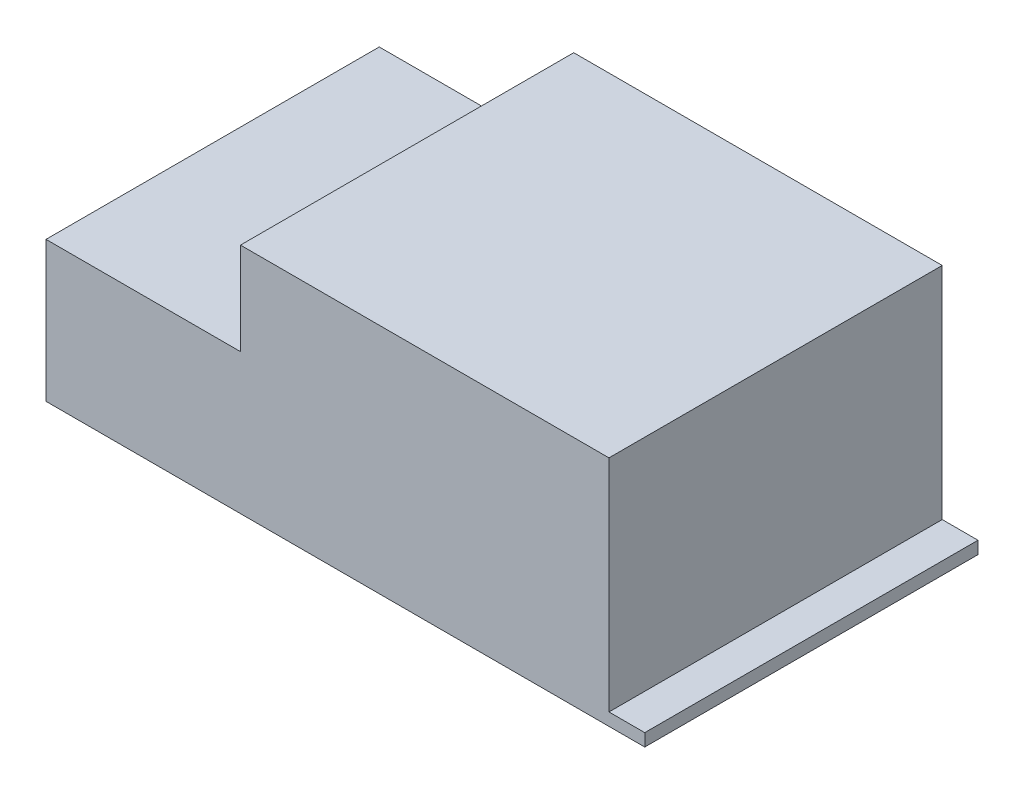
ISO-10303-21;
HEADER;
FILE_DESCRIPTION(('STEP AP214'),'2;1');
FILE_NAME('part.step','',(''),(''),'','','');
FILE_SCHEMA(('AUTOMOTIVE_DESIGN { 1 0 10303 214 1 1 1 1 }'));
ENDSEC;
DATA;
#1=APPLICATION_CONTEXT('core data for automotive mechanical design processes');
#2=APPLICATION_PROTOCOL_DEFINITION('international standard','automotive_design',2000,#1);
#3=PRODUCT_CONTEXT('',#1,'mechanical');
#4=PRODUCT('Part','Part','',(#3));
#5=PRODUCT_RELATED_PRODUCT_CATEGORY('part','',(#4));
#6=PRODUCT_DEFINITION_FORMATION('','',#4);
#7=PRODUCT_DEFINITION_CONTEXT('part definition',#1,'design');
#8=PRODUCT_DEFINITION('design','',#6,#7);
#9=PRODUCT_DEFINITION_SHAPE('','',#8);
#10=(LENGTH_UNIT() NAMED_UNIT(*) SI_UNIT(.MILLI.,.METRE.));
#11=(NAMED_UNIT(*) PLANE_ANGLE_UNIT() SI_UNIT($,.RADIAN.));
#12=(NAMED_UNIT(*) SI_UNIT($,.STERADIAN.) SOLID_ANGLE_UNIT());
#13=UNCERTAINTY_MEASURE_WITH_UNIT(LENGTH_MEASURE(1.E-05),#10,'distance_accuracy_value','');
#14=(GEOMETRIC_REPRESENTATION_CONTEXT(3) GLOBAL_UNCERTAINTY_ASSIGNED_CONTEXT((#13)) GLOBAL_UNIT_ASSIGNED_CONTEXT((#10,
#11,#12)) REPRESENTATION_CONTEXT('',''));
#15=CARTESIAN_POINT('',(0.,0.,0.));
#16=DIRECTION('',(0.,0.,1.));
#17=DIRECTION('',(1.,0.,0.));
#18=AXIS2_PLACEMENT_3D('',#15,#16,#17);
#19=CARTESIAN_POINT('',(-46.6871505090109,78.6556911879619,225.157566589967));
#20=DIRECTION('',(1.,0.,0.));
#21=DIRECTION('',(0.,1.,0.));
#22=AXIS2_PLACEMENT_3D('',#19,#20,#21);
#23=PLANE('',#22);
#24=CARTESIAN_POINT('',(-46.6871505090109,59.3229468039642,32.421386426818));
#25=DIRECTION('',(-1.,0.,0.));
#26=DIRECTION('',(0.,-1.,0.));
#27=AXIS2_PLACEMENT_3D('',#24,#25,#26);
#28=CIRCLE('',#27,5.51543289325506);
#29=CARTESIAN_POINT('',(-46.6871505090109,53.8075139107091,32.421386426818));
#30=VERTEX_POINT('',#29);
#31=EDGE_CURVE('E199',#30,#30,#28,.T.);
#32=ORIENTED_EDGE('',*,*,#31,.F.);
#33=EDGE_LOOP('',(#32));
#34=FACE_BOUND('',#33,.T.);
#35=DIRECTION('',(0.,0.,-1.));
#36=VECTOR('',#35,1.);
#37=CARTESIAN_POINT('',(-46.6871505090109,44.9711946730302,225.157566589967));
#38=LINE('',#37,#36);
#39=CARTESIAN_POINT('',(-46.6871505090109,44.9711946730302,70.958248184639));
#40=VERTEX_POINT('',#39);
#41=CARTESIAN_POINT('',(-46.6871505090109,44.9711946730302,-9.04175181536104));
#42=VERTEX_POINT('',#41);
#43=EDGE_CURVE('E226',#40,#42,#38,.T.);
#44=ORIENTED_EDGE('',*,*,#43,.F.);
#45=DIRECTION('',(0.,1.,0.));
#46=VECTOR('',#45,1.);
#47=CARTESIAN_POINT('',(-46.6871505090109,78.6556911879619,70.958248184639));
#48=LINE('',#47,#46);
#49=CARTESIAN_POINT('',(-46.6871505090109,78.6556911879619,70.9582481846391));
#50=VERTEX_POINT('',#49);
#51=EDGE_CURVE('E231',#40,#50,#48,.T.);
#52=ORIENTED_EDGE('',*,*,#51,.T.);
#53=DIRECTION('',(0.,0.,-1.));
#54=VECTOR('',#53,1.);
#55=CARTESIAN_POINT('',(-46.6871505090109,78.6556911879619,225.157566589967));
#56=LINE('',#55,#54);
#57=CARTESIAN_POINT('',(-46.6871505090109,78.6556911879619,-9.04175181536104));
#58=VERTEX_POINT('',#57);
#59=EDGE_CURVE('E243',#50,#58,#56,.T.);
#60=ORIENTED_EDGE('',*,*,#59,.T.);
#61=DIRECTION('',(0.,1.,0.));
#62=VECTOR('',#61,1.);
#63=CARTESIAN_POINT('',(-46.6871505090109,78.6556911879619,-9.04175181536104));
#64=LINE('',#63,#62);
#65=EDGE_CURVE('E217',#42,#58,#64,.T.);
#66=ORIENTED_EDGE('',*,*,#65,.F.);
#67=EDGE_LOOP('',(#44,#52,#60,#66));
#68=FACE_BOUND('',#67,.T.);
#69=ADVANCED_FACE('F39',(#34,#68),#23,.F.);
#70=CARTESIAN_POINT('',(0.,78.6556911879619,225.157566589967));
#71=DIRECTION('',(0.,-1.,0.));
#72=DIRECTION('',(0.,0.,-1.));
#73=AXIS2_PLACEMENT_3D('',#70,#71,#72);
#74=PLANE('',#73);
#75=ORIENTED_EDGE('',*,*,#59,.F.);
#76=DIRECTION('',(1.,0.,0.));
#77=VECTOR('',#76,1.);
#78=CARTESIAN_POINT('',(0.,78.6556911879619,70.958248184639));
#79=LINE('',#78,#77);
#80=CARTESIAN_POINT('',(0.,78.6556911879619,70.958248184639));
#81=VERTEX_POINT('',#80);
#82=EDGE_CURVE('E227',#50,#81,#79,.T.);
#83=ORIENTED_EDGE('',*,*,#82,.T.);
#84=DIRECTION('',(0.,0.,-1.));
#85=VECTOR('',#84,1.);
#86=CARTESIAN_POINT('',(0.,78.6556911879619,225.157566589967));
#87=LINE('',#86,#85);
#88=CARTESIAN_POINT('',(0.,78.6556911879619,-9.04175181536104));
#89=VERTEX_POINT('',#88);
#90=EDGE_CURVE('E245',#81,#89,#87,.T.);
#91=ORIENTED_EDGE('',*,*,#90,.T.);
#92=DIRECTION('',(1.,0.,0.));
#93=VECTOR('',#92,1.);
#94=CARTESIAN_POINT('',(0.,78.6556911879619,-9.04175181536104));
#95=LINE('',#94,#93);
#96=EDGE_CURVE('E214',#58,#89,#95,.T.);
#97=ORIENTED_EDGE('',*,*,#96,.F.);
#98=EDGE_LOOP('',(#75,#83,#91,#97));
#99=FACE_BOUND('',#98,.T.);
#100=ADVANCED_FACE('F285',(#99),#74,.F.);
#101=CARTESIAN_POINT('',(0.,100.803034254401,225.157566589967));
#102=DIRECTION('',(1.,0.,0.));
#103=DIRECTION('',(0.,0.,-1.));
#104=AXIS2_PLACEMENT_3D('',#101,#102,#103);
#105=PLANE('',#104);
#106=ORIENTED_EDGE('',*,*,#90,.F.);
#107=DIRECTION('',(0.,1.,0.));
#108=VECTOR('',#107,1.);
#109=CARTESIAN_POINT('',(0.,100.803034254401,70.958248184639));
#110=LINE('',#109,#108);
#111=CARTESIAN_POINT('',(0.,100.803034254401,70.958248184639));
#112=VERTEX_POINT('',#111);
#113=EDGE_CURVE('E230',#81,#112,#110,.T.);
#114=ORIENTED_EDGE('',*,*,#113,.T.);
#115=DIRECTION('',(0.,0.,-1.));
#116=VECTOR('',#115,1.);
#117=CARTESIAN_POINT('',(0.,100.803034254401,225.157566589967));
#118=LINE('',#117,#116);
#119=CARTESIAN_POINT('',(0.,100.803034254401,-9.04175181536104));
#120=VERTEX_POINT('',#119);
#121=EDGE_CURVE('E247',#112,#120,#118,.T.);
#122=ORIENTED_EDGE('',*,*,#121,.T.);
#123=DIRECTION('',(0.,1.,0.));
#124=VECTOR('',#123,1.);
#125=CARTESIAN_POINT('',(0.,100.803034254401,-9.04175181536104));
#126=LINE('',#125,#124);
#127=EDGE_CURVE('E211',#89,#120,#126,.T.);
#128=ORIENTED_EDGE('',*,*,#127,.F.);
#129=EDGE_LOOP('',(#106,#114,#122,#128));
#130=FACE_BOUND('',#129,.T.);
#131=ADVANCED_FACE('F282',(#130),#105,.F.);
#132=CARTESIAN_POINT('',(88.4595728208851,100.803034254401,225.157566589967));
#133=DIRECTION('',(0.,-1.,0.));
#134=DIRECTION('',(0.,0.,-1.));
#135=AXIS2_PLACEMENT_3D('',#132,#133,#134);
#136=PLANE('',#135);
#137=ORIENTED_EDGE('',*,*,#121,.F.);
#138=DIRECTION('',(1.,0.,0.));
#139=VECTOR('',#138,1.);
#140=CARTESIAN_POINT('',(88.4595728208851,100.803034254401,70.958248184639));
#141=LINE('',#140,#139);
#142=CARTESIAN_POINT('',(88.4595728208851,100.803034254401,70.958248184639));
#143=VERTEX_POINT('',#142);
#144=EDGE_CURVE('E234',#112,#143,#141,.T.);
#145=ORIENTED_EDGE('',*,*,#144,.T.);
#146=DIRECTION('',(0.,0.,-1.));
#147=VECTOR('',#146,1.);
#148=CARTESIAN_POINT('',(88.4595728208851,100.803034254401,225.157566589967));
#149=LINE('',#148,#147);
#150=CARTESIAN_POINT('',(88.4595728208851,100.803034254401,-9.04175181536104));
#151=VERTEX_POINT('',#150);
#152=EDGE_CURVE('E249',#143,#151,#149,.T.);
#153=ORIENTED_EDGE('',*,*,#152,.T.);
#154=DIRECTION('',(1.,0.,0.));
#155=VECTOR('',#154,1.);
#156=CARTESIAN_POINT('',(88.4595728208851,100.803034254401,-9.04175181536104));
#157=LINE('',#156,#155);
#158=EDGE_CURVE('E208',#120,#151,#157,.T.);
#159=ORIENTED_EDGE('',*,*,#158,.F.);
#160=EDGE_LOOP('',(#137,#145,#153,#159));
#161=FACE_BOUND('',#160,.T.);
#162=ADVANCED_FACE('F279',(#161),#136,.F.);
#163=CARTESIAN_POINT('',(88.4595728208851,47.9711946730302,225.157566589967));
#164=DIRECTION('',(-1.,0.,0.));
#165=DIRECTION('',(0.,0.,1.));
#166=AXIS2_PLACEMENT_3D('',#163,#164,#165);
#167=PLANE('',#166);
#168=ORIENTED_EDGE('',*,*,#152,.F.);
#169=DIRECTION('',(0.,-1.,0.));
#170=VECTOR('',#169,1.);
#171=CARTESIAN_POINT('',(88.4595728208851,47.9711946730302,70.958248184639));
#172=LINE('',#171,#170);
#173=CARTESIAN_POINT('',(88.4595728208851,47.9711946730302,70.958248184639));
#174=VERTEX_POINT('',#173);
#175=EDGE_CURVE('E237',#143,#174,#172,.T.);
#176=ORIENTED_EDGE('',*,*,#175,.T.);
#177=DIRECTION('',(0.,0.,-1.));
#178=VECTOR('',#177,1.);
#179=CARTESIAN_POINT('',(88.4595728208851,47.9711946730302,225.157566589967));
#180=LINE('',#179,#178);
#181=CARTESIAN_POINT('',(88.4595728208851,47.9711946730302,-9.04175181536104));
#182=VERTEX_POINT('',#181);
#183=EDGE_CURVE('E251',#174,#182,#180,.T.);
#184=ORIENTED_EDGE('',*,*,#183,.T.);
#185=DIRECTION('',(0.,-1.,0.));
#186=VECTOR('',#185,1.);
#187=CARTESIAN_POINT('',(88.4595728208851,47.9711946730302,-9.04175181536104));
#188=LINE('',#187,#186);
#189=EDGE_CURVE('E205',#151,#182,#188,.T.);
#190=ORIENTED_EDGE('',*,*,#189,.F.);
#191=EDGE_LOOP('',(#168,#176,#184,#190));
#192=FACE_BOUND('',#191,.T.);
#193=ADVANCED_FACE('F274',(#192),#167,.F.);
#194=CARTESIAN_POINT('',(97.0495375202736,47.9711946730302,225.157566589967));
#195=DIRECTION('',(0.,-1.,0.));
#196=DIRECTION('',(0.,0.,-1.));
#197=AXIS2_PLACEMENT_3D('',#194,#195,#196);
#198=PLANE('',#197);
#199=ORIENTED_EDGE('',*,*,#183,.F.);
#200=DIRECTION('',(1.,0.,0.));
#201=VECTOR('',#200,1.);
#202=CARTESIAN_POINT('',(97.0495375202736,47.9711946730302,70.958248184639));
#203=LINE('',#202,#201);
#204=CARTESIAN_POINT('',(97.0495375202736,47.9711946730302,70.958248184639));
#205=VERTEX_POINT('',#204);
#206=EDGE_CURVE('E60',#174,#205,#203,.T.);
#207=ORIENTED_EDGE('',*,*,#206,.T.);
#208=DIRECTION('',(0.,0.,-1.));
#209=VECTOR('',#208,1.);
#210=CARTESIAN_POINT('',(97.0495375202736,47.9711946730302,225.157566589967));
#211=LINE('',#210,#209);
#212=CARTESIAN_POINT('',(97.0495375202736,47.9711946730302,-9.04175181536104));
#213=VERTEX_POINT('',#212);
#214=EDGE_CURVE('E253',#205,#213,#211,.T.);
#215=ORIENTED_EDGE('',*,*,#214,.T.);
#216=DIRECTION('',(1.,0.,0.));
#217=VECTOR('',#216,1.);
#218=CARTESIAN_POINT('',(97.0495375202736,47.9711946730302,-9.04175181536104));
#219=LINE('',#218,#217);
#220=EDGE_CURVE('E202',#182,#213,#219,.T.);
#221=ORIENTED_EDGE('',*,*,#220,.F.);
#222=EDGE_LOOP('',(#199,#207,#215,#221));
#223=FACE_BOUND('',#222,.T.);
#224=ADVANCED_FACE('F270',(#223),#198,.F.);
#225=CARTESIAN_POINT('',(97.0495375202736,44.9711946730302,225.157566589967));
#226=DIRECTION('',(-1.,0.,0.));
#227=DIRECTION('',(0.,0.,1.));
#228=AXIS2_PLACEMENT_3D('',#225,#226,#227);
#229=PLANE('',#228);
#230=ORIENTED_EDGE('',*,*,#214,.F.);
#231=DIRECTION('',(0.,-1.,0.));
#232=VECTOR('',#231,1.);
#233=CARTESIAN_POINT('',(97.0495375202736,44.9711946730302,70.958248184639));
#234=LINE('',#233,#232);
#235=CARTESIAN_POINT('',(97.0495375202736,44.9711946730302,70.958248184639));
#236=VERTEX_POINT('',#235);
#237=EDGE_CURVE('E48',#205,#236,#234,.T.);
#238=ORIENTED_EDGE('',*,*,#237,.T.);
#239=DIRECTION('',(0.,0.,-1.));
#240=VECTOR('',#239,1.);
#241=CARTESIAN_POINT('',(97.0495375202736,44.9711946730302,225.157566589967));
#242=LINE('',#241,#240);
#243=CARTESIAN_POINT('',(97.0495375202736,44.9711946730302,-9.04175181536104));
#244=VERTEX_POINT('',#243);
#245=EDGE_CURVE('E255',#236,#244,#242,.T.);
#246=ORIENTED_EDGE('',*,*,#245,.T.);
#247=DIRECTION('',(0.,-1.,0.));
#248=VECTOR('',#247,1.);
#249=CARTESIAN_POINT('',(97.0495375202736,44.9711946730302,-9.04175181536104));
#250=LINE('',#249,#248);
#251=EDGE_CURVE('E223',#213,#244,#250,.T.);
#252=ORIENTED_EDGE('',*,*,#251,.F.);
#253=EDGE_LOOP('',(#230,#238,#246,#252));
#254=FACE_BOUND('',#253,.T.);
#255=ADVANCED_FACE('F267',(#254),#229,.F.);
#256=CARTESIAN_POINT('',(97.0495375202736,44.9711946730302,225.157566589967));
#257=DIRECTION('',(0.,1.,0.));
#258=DIRECTION('',(-1.,0.,0.));
#259=AXIS2_PLACEMENT_3D('',#256,#257,#258);
#260=PLANE('',#259);
#261=DIRECTION('',(-1.,0.,0.));
#262=VECTOR('',#261,1.);
#263=CARTESIAN_POINT('',(12.0495375202736,44.9711946730302,68.6561282459149));
#264=LINE('',#263,#262);
#265=CARTESIAN_POINT('',(87.0495375202736,44.9711946730302,68.6561282459149));
#266=VERTEX_POINT('',#265);
#267=CARTESIAN_POINT('',(-44.7410570305511,44.9711946730302,68.6561282459149));
#268=VERTEX_POINT('',#267);
#269=EDGE_CURVE('E174',#266,#268,#264,.T.);
#270=ORIENTED_EDGE('',*,*,#269,.F.);
#271=DIRECTION('',(0.,0.,1.));
#272=VECTOR('',#271,1.);
#273=CARTESIAN_POINT('',(87.0495375202736,44.9711946730302,68.6561282459149));
#274=LINE('',#273,#272);
#275=CARTESIAN_POINT('',(87.0495375202736,44.9711946730302,-7.28768999408511));
#276=VERTEX_POINT('',#275);
#277=EDGE_CURVE('E165',#276,#266,#274,.T.);
#278=ORIENTED_EDGE('',*,*,#277,.F.);
#279=DIRECTION('',(1.,0.,0.));
#280=VECTOR('',#279,1.);
#281=CARTESIAN_POINT('',(12.0495375202736,44.9711946730302,-7.2876899939221));
#282=LINE('',#281,#280);
#283=CARTESIAN_POINT('',(-44.7410570305511,44.9711946730302,-7.2876899939221));
#284=VERTEX_POINT('',#283);
#285=EDGE_CURVE('E181',#284,#276,#282,.T.);
#286=ORIENTED_EDGE('',*,*,#285,.F.);
#287=DIRECTION('',(0.,0.,-1.));
#288=VECTOR('',#287,1.);
#289=CARTESIAN_POINT('',(-44.7410570305511,44.9711946730302,68.6561282459149));
#290=LINE('',#289,#288);
#291=EDGE_CURVE('E192',#268,#284,#290,.T.);
#292=ORIENTED_EDGE('',*,*,#291,.F.);
#293=EDGE_LOOP('',(#270,#278,#286,#292));
#294=FACE_BOUND('',#293,.T.);
#295=ORIENTED_EDGE('',*,*,#245,.F.);
#296=DIRECTION('',(-1.,0.,0.));
#297=VECTOR('',#296,1.);
#298=CARTESIAN_POINT('',(97.0495375202736,44.9711946730302,70.958248184639));
#299=LINE('',#298,#297);
#300=EDGE_CURVE('E11',#236,#40,#299,.T.);
#301=ORIENTED_EDGE('',*,*,#300,.T.);
#302=ORIENTED_EDGE('',*,*,#43,.T.);
#303=DIRECTION('',(-1.,0.,0.));
#304=VECTOR('',#303,1.);
#305=CARTESIAN_POINT('',(97.0495375202736,44.9711946730302,-9.04175181536104));
#306=LINE('',#305,#304);
#307=EDGE_CURVE('E220',#244,#42,#306,.T.);
#308=ORIENTED_EDGE('',*,*,#307,.F.);
#309=EDGE_LOOP('',(#295,#301,#302,#308));
#310=FACE_BOUND('',#309,.T.);
#311=ADVANCED_FACE('F41',(#294,#310),#260,.F.);
#312=CARTESIAN_POINT('',(97.0495375202736,44.8229468039642,70.958248184639));
#313=DIRECTION('',(0.,0.,-1.));
#314=DIRECTION('',(-1.,0.,0.));
#315=AXIS2_PLACEMENT_3D('',#312,#313,#314);
#316=PLANE('',#315);
#317=ORIENTED_EDGE('',*,*,#237,.F.);
#318=ORIENTED_EDGE('',*,*,#206,.F.);
#319=ORIENTED_EDGE('',*,*,#175,.F.);
#320=ORIENTED_EDGE('',*,*,#144,.F.);
#321=ORIENTED_EDGE('',*,*,#113,.F.);
#322=ORIENTED_EDGE('',*,*,#82,.F.);
#323=ORIENTED_EDGE('',*,*,#51,.F.);
#324=ORIENTED_EDGE('',*,*,#300,.F.);
#325=EDGE_LOOP('',(#317,#318,#319,#320,#321,#322,#323,#324));
#326=FACE_BOUND('',#325,.T.);
#327=ADVANCED_FACE('F261',(#326),#316,.F.);
#328=CARTESIAN_POINT('',(12.0495375202736,44.8229468039642,-9.04175181536103));
#329=DIRECTION('',(0.,0.,1.));
#330=DIRECTION('',(1.,0.,0.));
#331=AXIS2_PLACEMENT_3D('',#328,#329,#330);
#332=PLANE('',#331);
#333=ORIENTED_EDGE('',*,*,#307,.T.);
#334=ORIENTED_EDGE('',*,*,#65,.T.);
#335=ORIENTED_EDGE('',*,*,#96,.T.);
#336=ORIENTED_EDGE('',*,*,#127,.T.);
#337=ORIENTED_EDGE('',*,*,#158,.T.);
#338=ORIENTED_EDGE('',*,*,#189,.T.);
#339=ORIENTED_EDGE('',*,*,#220,.T.);
#340=ORIENTED_EDGE('',*,*,#251,.T.);
#341=EDGE_LOOP('',(#333,#334,#335,#336,#337,#338,#339,#340));
#342=FACE_BOUND('',#341,.T.);
#343=ADVANCED_FACE('F287',(#342),#332,.F.);
#344=CARTESIAN_POINT('',(-24.6871505090109,59.3229468039642,32.421386426818));
#345=DIRECTION('',(-1.,0.,0.));
#346=DIRECTION('',(0.,-1.,0.));
#347=AXIS2_PLACEMENT_3D('',#344,#345,#346);
#348=CYLINDRICAL_SURFACE('',#347,5.51543289325506);
#349=CARTESIAN_POINT('',(-44.7410570305511,59.3229468039642,32.421386426818));
#350=DIRECTION('',(-1.,0.,0.));
#351=DIRECTION('',(0.,-1.,0.));
#352=AXIS2_PLACEMENT_3D('',#349,#350,#351);
#353=CIRCLE('',#352,5.51543289325506);
#354=CARTESIAN_POINT('',(-44.7410570305511,53.8075139107091,32.421386426818));
#355=VERTEX_POINT('',#354);
#356=EDGE_CURVE('E43',#355,#355,#353,.F.);
#357=ORIENTED_EDGE('',*,*,#356,.T.);
#358=EDGE_LOOP('',(#357));
#359=FACE_BOUND('',#358,.T.);
#360=ORIENTED_EDGE('',*,*,#31,.T.);
#361=EDGE_LOOP('',(#360));
#362=FACE_BOUND('',#361,.T.);
#363=ADVANCED_FACE('F289',(#359,#362),#348,.F.);
#364=CARTESIAN_POINT('',(-44.7410570305511,75.9711946730302,68.6561282459149));
#365=DIRECTION('',(-1.,0.,0.));
#366=DIRECTION('',(0.,-1.,0.));
#367=AXIS2_PLACEMENT_3D('',#364,#365,#366);
#368=PLANE('',#367);
#369=ORIENTED_EDGE('',*,*,#291,.T.);
#370=DIRECTION('',(0.,-1.,0.));
#371=VECTOR('',#370,1.);
#372=CARTESIAN_POINT('',(-44.7410570305511,75.9711946730302,-7.2876899939221));
#373=LINE('',#372,#371);
#374=CARTESIAN_POINT('',(-44.7410570305511,75.9711946730302,-7.2876899939221));
#375=VERTEX_POINT('',#374);
#376=EDGE_CURVE('E196',#375,#284,#373,.T.);
#377=ORIENTED_EDGE('',*,*,#376,.F.);
#378=DIRECTION('',(0.,0.,-1.));
#379=VECTOR('',#378,1.);
#380=CARTESIAN_POINT('',(-44.7410570305511,75.9711946730302,68.6561282459149));
#381=LINE('',#380,#379);
#382=CARTESIAN_POINT('',(-44.7410570305511,75.9711946730302,68.6561282459149));
#383=VERTEX_POINT('',#382);
#384=EDGE_CURVE('E184',#383,#375,#381,.T.);
#385=ORIENTED_EDGE('',*,*,#384,.F.);
#386=DIRECTION('',(0.,-1.,0.));
#387=VECTOR('',#386,1.);
#388=CARTESIAN_POINT('',(-44.7410570305511,75.9711946730302,68.6561282459149));
#389=LINE('',#388,#387);
#390=EDGE_CURVE('E189',#383,#268,#389,.T.);
#391=ORIENTED_EDGE('',*,*,#390,.T.);
#392=EDGE_LOOP('',(#369,#377,#385,#391));
#393=FACE_BOUND('',#392,.T.);
#394=ORIENTED_EDGE('',*,*,#356,.F.);
#395=EDGE_LOOP('',(#394));
#396=FACE_BOUND('',#395,.T.);
#397=ADVANCED_FACE('F296',(#393,#396),#368,.F.);
#398=CARTESIAN_POINT('',(12.0495375202736,75.9711946730302,-7.2876899939221));
#399=DIRECTION('',(0.,0.,-1.));
#400=DIRECTION('',(-1.,0.,0.));
#401=AXIS2_PLACEMENT_3D('',#398,#399,#400);
#402=PLANE('',#401);
#403=ORIENTED_EDGE('',*,*,#285,.T.);
#404=DIRECTION('',(0.,-1.,0.));
#405=VECTOR('',#404,1.);
#406=CARTESIAN_POINT('',(87.0495375202736,95.9711946730302,-7.28768999408511));
#407=LINE('',#406,#405);
#408=CARTESIAN_POINT('',(87.0495375202736,95.9711946730302,-7.28768999408511));
#409=VERTEX_POINT('',#408);
#410=EDGE_CURVE('E151',#409,#276,#407,.T.);
#411=ORIENTED_EDGE('',*,*,#410,.F.);
#412=DIRECTION('',(1.,0.,0.));
#413=VECTOR('',#412,1.);
#414=CARTESIAN_POINT('',(12.0495375202736,95.9711946730302,-7.28768999408511));
#415=LINE('',#414,#413);
#416=CARTESIAN_POINT('',(12.0495375202736,95.9711946730302,-7.28768999408511));
#417=VERTEX_POINT('',#416);
#418=EDGE_CURVE('E155',#417,#409,#415,.T.);
#419=ORIENTED_EDGE('',*,*,#418,.F.);
#420=DIRECTION('',(0.,-1.,0.));
#421=VECTOR('',#420,1.);
#422=CARTESIAN_POINT('',(12.0495375202736,95.9711946730302,-7.28768999408511));
#423=LINE('',#422,#421);
#424=CARTESIAN_POINT('',(12.0495375202736,75.9711946730302,-7.28768999408511));
#425=VERTEX_POINT('',#424);
#426=EDGE_CURVE('E140',#417,#425,#423,.T.);
#427=ORIENTED_EDGE('',*,*,#426,.T.);
#428=DIRECTION('',(1.,0.,0.));
#429=VECTOR('',#428,1.);
#430=CARTESIAN_POINT('',(12.0495375202736,75.9711946730302,-7.2876899939221));
#431=LINE('',#430,#429);
#432=EDGE_CURVE('E187',#375,#425,#431,.T.);
#433=ORIENTED_EDGE('',*,*,#432,.F.);
#434=ORIENTED_EDGE('',*,*,#376,.T.);
#435=EDGE_LOOP('',(#403,#411,#419,#427,#433,#434));
#436=FACE_BOUND('',#435,.T.);
#437=ADVANCED_FACE('F156',(#436),#402,.F.);
#438=CARTESIAN_POINT('',(12.0495375202736,75.9711946730302,68.6561282459149));
#439=DIRECTION('',(0.,0.,1.));
#440=DIRECTION('',(1.,0.,0.));
#441=AXIS2_PLACEMENT_3D('',#438,#439,#440);
#442=PLANE('',#441);
#443=ORIENTED_EDGE('',*,*,#269,.T.);
#444=ORIENTED_EDGE('',*,*,#390,.F.);
#445=DIRECTION('',(-1.,0.,0.));
#446=VECTOR('',#445,1.);
#447=CARTESIAN_POINT('',(12.0495375202736,75.9711946730302,68.6561282459149));
#448=LINE('',#447,#446);
#449=CARTESIAN_POINT('',(12.0495375202736,75.9711946730302,68.6561282459149));
#450=VERTEX_POINT('',#449);
#451=EDGE_CURVE('E180',#450,#383,#448,.T.);
#452=ORIENTED_EDGE('',*,*,#451,.F.);
#453=DIRECTION('',(0.,-1.,0.));
#454=VECTOR('',#453,1.);
#455=CARTESIAN_POINT('',(12.0495375202736,95.9711946730302,68.6561282459149));
#456=LINE('',#455,#454);
#457=CARTESIAN_POINT('',(12.0495375202736,95.9711946730302,68.6561282459149));
#458=VERTEX_POINT('',#457);
#459=EDGE_CURVE('E172',#458,#450,#456,.T.);
#460=ORIENTED_EDGE('',*,*,#459,.F.);
#461=DIRECTION('',(-1.,0.,0.));
#462=VECTOR('',#461,1.);
#463=CARTESIAN_POINT('',(12.0495375202736,95.9711946730302,68.6561282459149));
#464=LINE('',#463,#462);
#465=CARTESIAN_POINT('',(87.0495375202736,95.9711946730302,68.6561282459149));
#466=VERTEX_POINT('',#465);
#467=EDGE_CURVE('E152',#466,#458,#464,.T.);
#468=ORIENTED_EDGE('',*,*,#467,.F.);
#469=DIRECTION('',(0.,-1.,0.));
#470=VECTOR('',#469,1.);
#471=CARTESIAN_POINT('',(87.0495375202736,95.9711946730302,68.6561282459149));
#472=LINE('',#471,#470);
#473=EDGE_CURVE('E175',#466,#266,#472,.T.);
#474=ORIENTED_EDGE('',*,*,#473,.T.);
#475=EDGE_LOOP('',(#443,#444,#452,#460,#468,#474));
#476=FACE_BOUND('',#475,.T.);
#477=ADVANCED_FACE('F328',(#476),#442,.F.);
#478=CARTESIAN_POINT('',(0.,75.9711946730302,0.));
#479=DIRECTION('',(0.,1.,0.));
#480=DIRECTION('',(-1.,0.,0.));
#481=AXIS2_PLACEMENT_3D('',#478,#479,#480);
#482=PLANE('',#481);
#483=DIRECTION('',(0.,0.,1.));
#484=VECTOR('',#483,1.);
#485=CARTESIAN_POINT('',(12.0495375202736,75.9711946730302,68.6561282459149));
#486=LINE('',#485,#484);
#487=EDGE_CURVE('E147',#425,#450,#486,.T.);
#488=ORIENTED_EDGE('',*,*,#487,.T.);
#489=ORIENTED_EDGE('',*,*,#451,.T.);
#490=ORIENTED_EDGE('',*,*,#384,.T.);
#491=ORIENTED_EDGE('',*,*,#432,.T.);
#492=EDGE_LOOP('',(#488,#489,#490,#491));
#493=FACE_BOUND('',#492,.T.);
#494=ADVANCED_FACE('F338',(#493),#482,.F.);
#495=CARTESIAN_POINT('',(12.0495375202736,95.9711946730302,68.6561282459149));
#496=DIRECTION('',(-1.,0.,0.));
#497=DIRECTION('',(0.,-1.,0.));
#498=AXIS2_PLACEMENT_3D('',#495,#496,#497);
#499=PLANE('',#498);
#500=ORIENTED_EDGE('',*,*,#426,.F.);
#501=DIRECTION('',(0.,0.,-1.));
#502=VECTOR('',#501,1.);
#503=CARTESIAN_POINT('',(12.0495375202736,95.9711946730302,68.6561282459149));
#504=LINE('',#503,#502);
#505=EDGE_CURVE('E144',#458,#417,#504,.T.);
#506=ORIENTED_EDGE('',*,*,#505,.F.);
#507=ORIENTED_EDGE('',*,*,#459,.T.);
#508=ORIENTED_EDGE('',*,*,#487,.F.);
#509=EDGE_LOOP('',(#500,#506,#507,#508));
#510=FACE_BOUND('',#509,.T.);
#511=ADVANCED_FACE('F142',(#510),#499,.F.);
#512=CARTESIAN_POINT('',(87.0495375202736,95.9711946730302,68.6561282459149));
#513=DIRECTION('',(1.,0.,0.));
#514=DIRECTION('',(0.,0.,-1.));
#515=AXIS2_PLACEMENT_3D('',#512,#513,#514);
#516=PLANE('',#515);
#517=ORIENTED_EDGE('',*,*,#277,.T.);
#518=ORIENTED_EDGE('',*,*,#473,.F.);
#519=DIRECTION('',(0.,0.,1.));
#520=VECTOR('',#519,1.);
#521=CARTESIAN_POINT('',(87.0495375202736,95.9711946730302,68.6561282459149));
#522=LINE('',#521,#520);
#523=EDGE_CURVE('E161',#409,#466,#522,.T.);
#524=ORIENTED_EDGE('',*,*,#523,.F.);
#525=ORIENTED_EDGE('',*,*,#410,.T.);
#526=EDGE_LOOP('',(#517,#518,#524,#525));
#527=FACE_BOUND('',#526,.T.);
#528=ADVANCED_FACE('F330',(#527),#516,.F.);
#529=CARTESIAN_POINT('',(0.,95.9711946730302,0.));
#530=DIRECTION('',(0.,-1.,0.));
#531=DIRECTION('',(1.,0.,0.));
#532=AXIS2_PLACEMENT_3D('',#529,#530,#531);
#533=PLANE('',#532);
#534=ORIENTED_EDGE('',*,*,#505,.T.);
#535=ORIENTED_EDGE('',*,*,#418,.T.);
#536=ORIENTED_EDGE('',*,*,#523,.T.);
#537=ORIENTED_EDGE('',*,*,#467,.T.);
#538=EDGE_LOOP('',(#534,#535,#536,#537));
#539=FACE_BOUND('',#538,.T.);
#540=ADVANCED_FACE('F163',(#539),#533,.T.);
#541=CLOSED_SHELL('',(#69,#100,#131,#162,#193,#224,#255,#311,#327,#343,#363,#397,#437,#477,#494,
#511,#528,#540));
#542=MANIFOLD_SOLID_BREP('B2',#541);
#543=ADVANCED_BREP_SHAPE_REPRESENTATION('',(#18,#542),#14);
#544=SHAPE_DEFINITION_REPRESENTATION(#9,#543);
ENDSEC;
END-ISO-10303-21;
